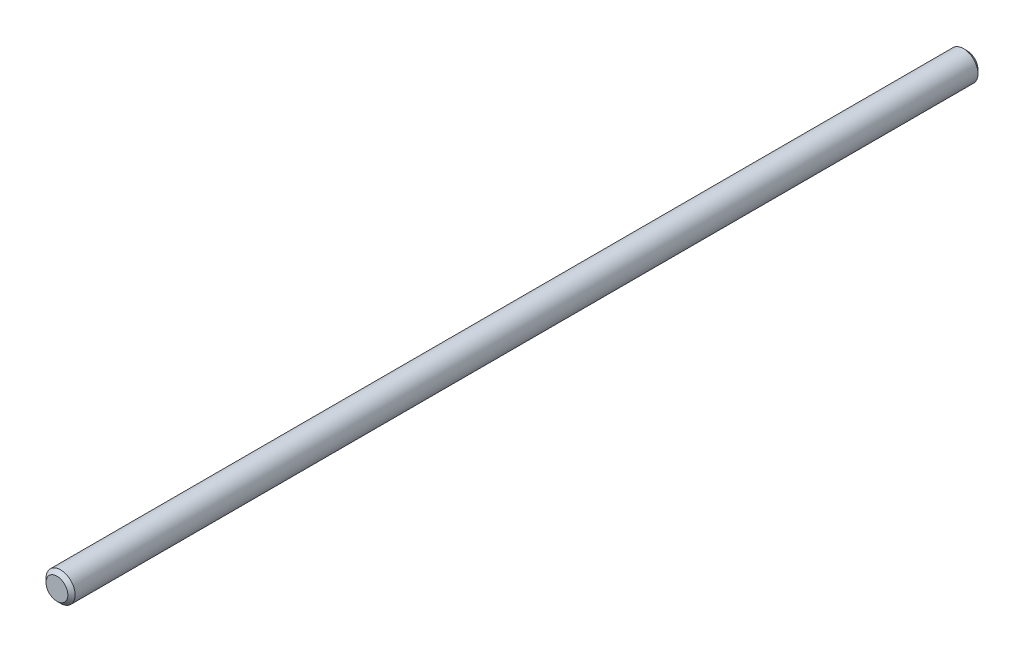
ISO-10303-21;
HEADER;
FILE_DESCRIPTION(('STEP AP214'),'2;1');
FILE_NAME('part.step','',(''),(''),'','','');
FILE_SCHEMA(('AUTOMOTIVE_DESIGN { 1 0 10303 214 1 1 1 1 }'));
ENDSEC;
DATA;
#1=APPLICATION_CONTEXT('core data for automotive mechanical design processes');
#2=APPLICATION_PROTOCOL_DEFINITION('international standard','automotive_design',2000,#1);
#3=PRODUCT_CONTEXT('',#1,'mechanical');
#4=PRODUCT('Part','Part','',(#3));
#5=PRODUCT_RELATED_PRODUCT_CATEGORY('part','',(#4));
#6=PRODUCT_DEFINITION_FORMATION('','',#4);
#7=PRODUCT_DEFINITION_CONTEXT('part definition',#1,'design');
#8=PRODUCT_DEFINITION('design','',#6,#7);
#9=PRODUCT_DEFINITION_SHAPE('','',#8);
#10=(LENGTH_UNIT() NAMED_UNIT(*) SI_UNIT(.MILLI.,.METRE.));
#11=(NAMED_UNIT(*) PLANE_ANGLE_UNIT() SI_UNIT($,.RADIAN.));
#12=(NAMED_UNIT(*) SI_UNIT($,.STERADIAN.) SOLID_ANGLE_UNIT());
#13=UNCERTAINTY_MEASURE_WITH_UNIT(LENGTH_MEASURE(1.E-05),#10,'distance_accuracy_value','');
#14=(GEOMETRIC_REPRESENTATION_CONTEXT(3) GLOBAL_UNCERTAINTY_ASSIGNED_CONTEXT((#13)) GLOBAL_UNIT_ASSIGNED_CONTEXT((#10,
#11,#12)) REPRESENTATION_CONTEXT('',''));
#15=CARTESIAN_POINT('',(0.,0.,0.));
#16=DIRECTION('',(0.,0.,1.));
#17=DIRECTION('',(1.,0.,0.));
#18=AXIS2_PLACEMENT_3D('',#15,#16,#17);
#19=CARTESIAN_POINT('',(0.,0.,-125.));
#20=DIRECTION('',(0.,0.,1.));
#21=DIRECTION('',(1.,0.,0.));
#22=AXIS2_PLACEMENT_3D('',#19,#20,#21);
#23=CYLINDRICAL_SURFACE('',#22,2.);
#24=CARTESIAN_POINT('',(0.,0.,-124.5));
#25=DIRECTION('',(0.,0.,1.));
#26=DIRECTION('',(1.,0.,0.));
#27=AXIS2_PLACEMENT_3D('',#24,#25,#26);
#28=CIRCLE('',#27,2.);
#29=CARTESIAN_POINT('',(2.,0.,-124.5));
#30=VERTEX_POINT('',#29);
#31=EDGE_CURVE('E48',#30,#30,#28,.T.);
#32=ORIENTED_EDGE('',*,*,#31,.T.);
#33=EDGE_LOOP('',(#32));
#34=FACE_BOUND('',#33,.T.);
#35=CARTESIAN_POINT('',(0.,0.,-0.5));
#36=DIRECTION('',(0.,0.,1.));
#37=DIRECTION('',(1.,0.,0.));
#38=AXIS2_PLACEMENT_3D('',#35,#36,#37);
#39=CIRCLE('',#38,2.);
#40=CARTESIAN_POINT('',(2.,0.,-0.5));
#41=VERTEX_POINT('',#40);
#42=EDGE_CURVE('E52',#41,#41,#39,.F.);
#43=ORIENTED_EDGE('',*,*,#42,.T.);
#44=EDGE_LOOP('',(#43));
#45=FACE_BOUND('',#44,.T.);
#46=ADVANCED_FACE('F37',(#34,#45),#23,.T.);
#47=CARTESIAN_POINT('',(0.,0.,-125.));
#48=DIRECTION('',(0.,0.,1.));
#49=DIRECTION('',(1.,0.,0.));
#50=AXIS2_PLACEMENT_3D('',#47,#48,#49);
#51=PLANE('',#50);
#52=CARTESIAN_POINT('',(0.,0.,-125.));
#53=DIRECTION('',(0.,0.,1.));
#54=DIRECTION('',(1.,0.,0.));
#55=AXIS2_PLACEMENT_3D('',#52,#53,#54);
#56=CIRCLE('',#55,1.5);
#57=CARTESIAN_POINT('',(1.5,0.,-125.));
#58=VERTEX_POINT('',#57);
#59=EDGE_CURVE('E44',#58,#58,#56,.F.);
#60=ORIENTED_EDGE('',*,*,#59,.T.);
#61=EDGE_LOOP('',(#60));
#62=FACE_BOUND('',#61,.T.);
#63=ADVANCED_FACE('F68',(#62),#51,.F.);
#64=CARTESIAN_POINT('',(0.,0.,0.));
#65=DIRECTION('',(0.,0.,1.));
#66=DIRECTION('',(1.,0.,0.));
#67=AXIS2_PLACEMENT_3D('',#64,#65,#66);
#68=PLANE('',#67);
#69=CARTESIAN_POINT('',(0.,0.,0.));
#70=DIRECTION('',(0.,0.,1.));
#71=DIRECTION('',(1.,0.,0.));
#72=AXIS2_PLACEMENT_3D('',#69,#70,#71);
#73=CIRCLE('',#72,1.49999999999999);
#74=CARTESIAN_POINT('',(1.49999999999999,0.,0.));
#75=VERTEX_POINT('',#74);
#76=EDGE_CURVE('E10',#75,#75,#73,.T.);
#77=ORIENTED_EDGE('',*,*,#76,.T.);
#78=EDGE_LOOP('',(#77));
#79=FACE_BOUND('',#78,.T.);
#80=ADVANCED_FACE('F65',(#79),#68,.T.);
#81=CARTESIAN_POINT('',(0.,0.,-124.5));
#82=DIRECTION('',(0.,0.,1.));
#83=DIRECTION('',(1.,0.,0.));
#84=AXIS2_PLACEMENT_3D('',#81,#82,#83);
#85=CONICAL_SURFACE('',#84,2.,0.785398163397447);
#86=ORIENTED_EDGE('',*,*,#59,.F.);
#87=EDGE_LOOP('',(#86));
#88=FACE_BOUND('',#87,.T.);
#89=ORIENTED_EDGE('',*,*,#31,.F.);
#90=EDGE_LOOP('',(#89));
#91=FACE_BOUND('',#90,.T.);
#92=ADVANCED_FACE('F61',(#88,#91),#85,.T.);
#93=CARTESIAN_POINT('',(0.,0.,0.));
#94=DIRECTION('',(0.,0.,-1.));
#95=DIRECTION('',(-1.,0.,0.));
#96=AXIS2_PLACEMENT_3D('',#93,#94,#95);
#97=CONICAL_SURFACE('',#96,1.49999999999999,0.78539816339746);
#98=ORIENTED_EDGE('',*,*,#42,.F.);
#99=EDGE_LOOP('',(#98));
#100=FACE_BOUND('',#99,.T.);
#101=ORIENTED_EDGE('',*,*,#76,.F.);
#102=EDGE_LOOP('',(#101));
#103=FACE_BOUND('',#102,.T.);
#104=ADVANCED_FACE('F39',(#100,#103),#97,.T.);
#105=CLOSED_SHELL('',(#46,#63,#80,#92,#104));
#106=MANIFOLD_SOLID_BREP('B2',#105);
#107=ADVANCED_BREP_SHAPE_REPRESENTATION('',(#18,#106),#14);
#108=SHAPE_DEFINITION_REPRESENTATION(#9,#107);
ENDSEC;
END-ISO-10303-21;
